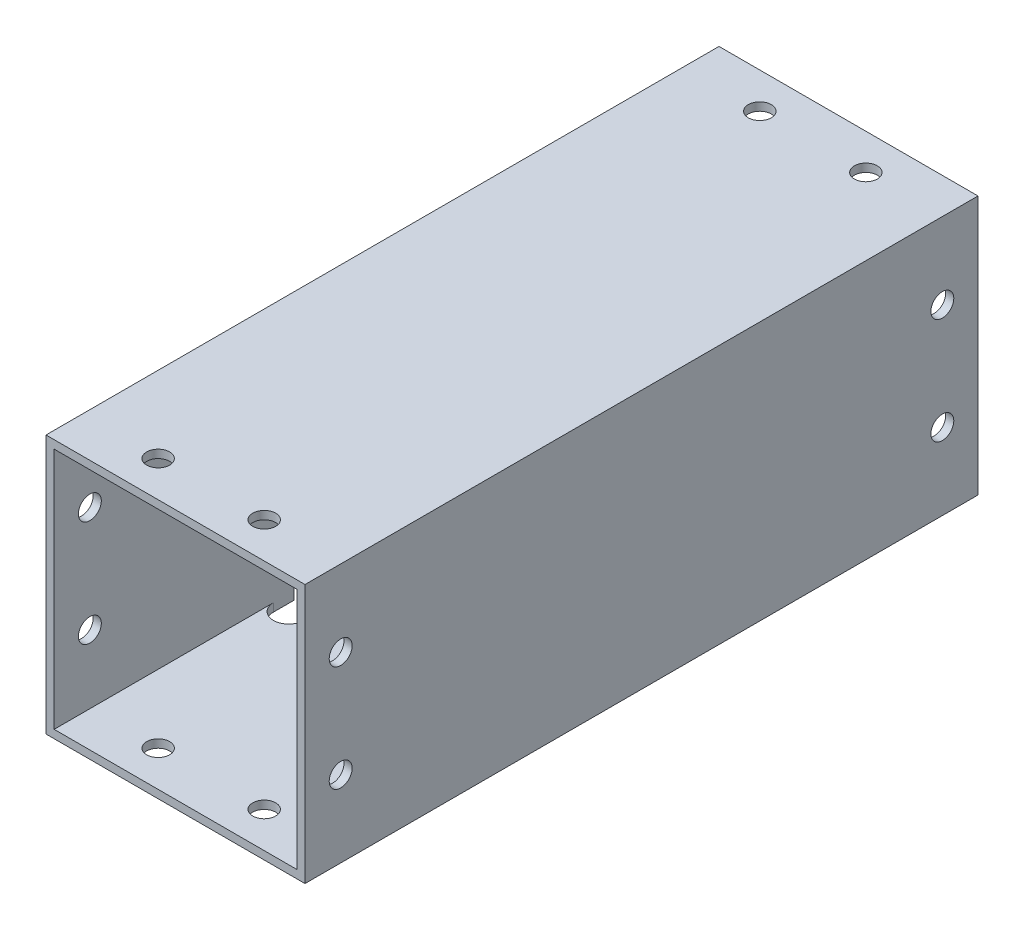
ISO-10303-21;
HEADER;
FILE_DESCRIPTION(('STEP AP214'),'2;1');
FILE_NAME('part.step','',(''),(''),'','','');
FILE_SCHEMA(('AUTOMOTIVE_DESIGN { 1 0 10303 214 1 1 1 1 }'));
ENDSEC;
DATA;
#1=APPLICATION_CONTEXT('core data for automotive mechanical design processes');
#2=APPLICATION_PROTOCOL_DEFINITION('international standard','automotive_design',2000,#1);
#3=PRODUCT_CONTEXT('',#1,'mechanical');
#4=PRODUCT('Part','Part','',(#3));
#5=PRODUCT_RELATED_PRODUCT_CATEGORY('part','',(#4));
#6=PRODUCT_DEFINITION_FORMATION('','',#4);
#7=PRODUCT_DEFINITION_CONTEXT('part definition',#1,'design');
#8=PRODUCT_DEFINITION('design','',#6,#7);
#9=PRODUCT_DEFINITION_SHAPE('','',#8);
#10=(LENGTH_UNIT() NAMED_UNIT(*) SI_UNIT(.MILLI.,.METRE.));
#11=(NAMED_UNIT(*) PLANE_ANGLE_UNIT() SI_UNIT($,.RADIAN.));
#12=(NAMED_UNIT(*) SI_UNIT($,.STERADIAN.) SOLID_ANGLE_UNIT());
#13=UNCERTAINTY_MEASURE_WITH_UNIT(LENGTH_MEASURE(1.E-05),#10,'distance_accuracy_value','');
#14=(GEOMETRIC_REPRESENTATION_CONTEXT(3) GLOBAL_UNCERTAINTY_ASSIGNED_CONTEXT((#13)) GLOBAL_UNIT_ASSIGNED_CONTEXT((#10,
#11,#12)) REPRESENTATION_CONTEXT('',''));
#15=CARTESIAN_POINT('',(0.,0.,0.));
#16=DIRECTION('',(0.,0.,1.));
#17=DIRECTION('',(1.,0.,0.));
#18=AXIS2_PLACEMENT_3D('',#15,#16,#17);
#19=CARTESIAN_POINT('',(0.,0.,132.));
#20=DIRECTION('',(0.,0.,-1.));
#21=DIRECTION('',(-1.,0.,0.));
#22=AXIS2_PLACEMENT_3D('',#19,#20,#21);
#23=PLANE('',#22);
#24=DIRECTION('',(0.,1.,0.));
#25=VECTOR('',#24,1.);
#26=CARTESIAN_POINT('',(25.4,-25.4,132.));
#27=LINE('',#26,#25);
#28=CARTESIAN_POINT('',(25.4,-25.4,132.));
#29=VERTEX_POINT('',#28);
#30=CARTESIAN_POINT('',(25.4,25.4,132.));
#31=VERTEX_POINT('',#30);
#32=EDGE_CURVE('E327',#29,#31,#27,.T.);
#33=ORIENTED_EDGE('',*,*,#32,.T.);
#34=DIRECTION('',(-1.,0.,0.));
#35=VECTOR('',#34,1.);
#36=CARTESIAN_POINT('',(-25.4,25.4,132.));
#37=LINE('',#36,#35);
#38=CARTESIAN_POINT('',(-25.4,25.4,132.));
#39=VERTEX_POINT('',#38);
#40=EDGE_CURVE('E330',#31,#39,#37,.T.);
#41=ORIENTED_EDGE('',*,*,#40,.T.);
#42=DIRECTION('',(0.,-1.,0.));
#43=VECTOR('',#42,1.);
#44=CARTESIAN_POINT('',(-25.4,-25.4,132.));
#45=LINE('',#44,#43);
#46=CARTESIAN_POINT('',(-25.4,-25.4,132.));
#47=VERTEX_POINT('',#46);
#48=EDGE_CURVE('E333',#39,#47,#45,.T.);
#49=ORIENTED_EDGE('',*,*,#48,.T.);
#50=DIRECTION('',(1.,0.,0.));
#51=VECTOR('',#50,1.);
#52=CARTESIAN_POINT('',(-25.4,-25.4,132.));
#53=LINE('',#52,#51);
#54=EDGE_CURVE('E335',#47,#29,#53,.T.);
#55=ORIENTED_EDGE('',*,*,#54,.T.);
#56=EDGE_LOOP('',(#33,#41,#49,#55));
#57=FACE_BOUND('',#56,.T.);
#58=DIRECTION('',(0.,-1.,0.));
#59=VECTOR('',#58,1.);
#60=CARTESIAN_POINT('',(-23.8,-23.8,132.));
#61=LINE('',#60,#59);
#62=CARTESIAN_POINT('',(-23.8,23.8,132.));
#63=VERTEX_POINT('',#62);
#64=CARTESIAN_POINT('',(-23.8,-23.8,132.));
#65=VERTEX_POINT('',#64);
#66=EDGE_CURVE('E299',#63,#65,#61,.T.);
#67=ORIENTED_EDGE('',*,*,#66,.F.);
#68=DIRECTION('',(-1.,0.,0.));
#69=VECTOR('',#68,1.);
#70=CARTESIAN_POINT('',(-23.8,23.8,132.));
#71=LINE('',#70,#69);
#72=CARTESIAN_POINT('',(23.8,23.8,132.));
#73=VERTEX_POINT('',#72);
#74=EDGE_CURVE('E306',#73,#63,#71,.T.);
#75=ORIENTED_EDGE('',*,*,#74,.F.);
#76=DIRECTION('',(0.,1.,0.));
#77=VECTOR('',#76,1.);
#78=CARTESIAN_POINT('',(23.8,-23.8,132.));
#79=LINE('',#78,#77);
#80=CARTESIAN_POINT('',(23.8,-23.8,132.));
#81=VERTEX_POINT('',#80);
#82=EDGE_CURVE('E304',#81,#73,#79,.T.);
#83=ORIENTED_EDGE('',*,*,#82,.F.);
#84=DIRECTION('',(1.,0.,0.));
#85=VECTOR('',#84,1.);
#86=CARTESIAN_POINT('',(-23.8,-23.8,132.));
#87=LINE('',#86,#85);
#88=EDGE_CURVE('E301',#65,#81,#87,.T.);
#89=ORIENTED_EDGE('',*,*,#88,.F.);
#90=EDGE_LOOP('',(#67,#75,#83,#89));
#91=FACE_BOUND('',#90,.T.);
#92=ADVANCED_FACE('F38',(#57,#91),#23,.F.);
#93=CARTESIAN_POINT('',(0.,0.,0.));
#94=DIRECTION('',(0.,0.,-1.));
#95=DIRECTION('',(-1.,0.,0.));
#96=AXIS2_PLACEMENT_3D('',#93,#94,#95);
#97=PLANE('',#96);
#98=DIRECTION('',(0.,1.,0.));
#99=VECTOR('',#98,1.);
#100=CARTESIAN_POINT('',(25.4,-25.4,0.));
#101=LINE('',#100,#99);
#102=CARTESIAN_POINT('',(25.4,-25.4,0.));
#103=VERTEX_POINT('',#102);
#104=CARTESIAN_POINT('',(25.4,25.4,0.));
#105=VERTEX_POINT('',#104);
#106=EDGE_CURVE('E326',#103,#105,#101,.T.);
#107=ORIENTED_EDGE('',*,*,#106,.F.);
#108=DIRECTION('',(1.,0.,0.));
#109=VECTOR('',#108,1.);
#110=CARTESIAN_POINT('',(-25.4,-25.4,0.));
#111=LINE('',#110,#109);
#112=CARTESIAN_POINT('',(-25.4,-25.4,0.));
#113=VERTEX_POINT('',#112);
#114=EDGE_CURVE('E331',#113,#103,#111,.T.);
#115=ORIENTED_EDGE('',*,*,#114,.F.);
#116=DIRECTION('',(0.,-1.,0.));
#117=VECTOR('',#116,1.);
#118=CARTESIAN_POINT('',(-25.4,-25.4,0.));
#119=LINE('',#118,#117);
#120=CARTESIAN_POINT('',(-25.4,25.4,0.));
#121=VERTEX_POINT('',#120);
#122=EDGE_CURVE('E342',#121,#113,#119,.T.);
#123=ORIENTED_EDGE('',*,*,#122,.F.);
#124=DIRECTION('',(-1.,0.,0.));
#125=VECTOR('',#124,1.);
#126=CARTESIAN_POINT('',(-25.4,25.4,0.));
#127=LINE('',#126,#125);
#128=EDGE_CURVE('E340',#105,#121,#127,.T.);
#129=ORIENTED_EDGE('',*,*,#128,.F.);
#130=EDGE_LOOP('',(#107,#115,#123,#129));
#131=FACE_BOUND('',#130,.T.);
#132=DIRECTION('',(-1.,0.,0.));
#133=VECTOR('',#132,1.);
#134=CARTESIAN_POINT('',(-23.8,23.8,0.));
#135=LINE('',#134,#133);
#136=CARTESIAN_POINT('',(23.8,23.8,0.));
#137=VERTEX_POINT('',#136);
#138=CARTESIAN_POINT('',(-23.8,23.8,0.));
#139=VERTEX_POINT('',#138);
#140=EDGE_CURVE('E302',#137,#139,#135,.T.);
#141=ORIENTED_EDGE('',*,*,#140,.T.);
#142=DIRECTION('',(0.,-1.,0.));
#143=VECTOR('',#142,1.);
#144=CARTESIAN_POINT('',(-23.8,-23.8,0.));
#145=LINE('',#144,#143);
#146=CARTESIAN_POINT('',(-23.8,-23.8,0.));
#147=VERTEX_POINT('',#146);
#148=EDGE_CURVE('E61',#139,#147,#145,.T.);
#149=ORIENTED_EDGE('',*,*,#148,.T.);
#150=DIRECTION('',(1.,0.,0.));
#151=VECTOR('',#150,1.);
#152=CARTESIAN_POINT('',(-23.8,-23.8,0.));
#153=LINE('',#152,#151);
#154=CARTESIAN_POINT('',(23.8,-23.8,0.));
#155=VERTEX_POINT('',#154);
#156=EDGE_CURVE('E310',#147,#155,#153,.T.);
#157=ORIENTED_EDGE('',*,*,#156,.T.);
#158=DIRECTION('',(0.,1.,0.));
#159=VECTOR('',#158,1.);
#160=CARTESIAN_POINT('',(23.8,-23.8,0.));
#161=LINE('',#160,#159);
#162=EDGE_CURVE('E313',#155,#137,#161,.T.);
#163=ORIENTED_EDGE('',*,*,#162,.T.);
#164=EDGE_LOOP('',(#141,#149,#157,#163));
#165=FACE_BOUND('',#164,.T.);
#166=ADVANCED_FACE('F398',(#131,#165),#97,.T.);
#167=CARTESIAN_POINT('',(25.4,-25.4,132.));
#168=DIRECTION('',(-1.,0.,0.));
#169=DIRECTION('',(0.,0.,1.));
#170=AXIS2_PLACEMENT_3D('',#167,#168,#169);
#171=PLANE('',#170);
#172=CARTESIAN_POINT('',(25.4,-10.4,125.));
#173=DIRECTION('',(1.,0.,0.));
#174=DIRECTION('',(0.,0.,-1.));
#175=AXIS2_PLACEMENT_3D('',#172,#173,#174);
#176=CIRCLE('',#175,2.24999999999999);
#177=CARTESIAN_POINT('',(25.4,-10.4,122.75));
#178=VERTEX_POINT('',#177);
#179=EDGE_CURVE('E223',#178,#178,#176,.T.);
#180=ORIENTED_EDGE('',*,*,#179,.F.);
#181=EDGE_LOOP('',(#180));
#182=FACE_BOUND('',#181,.T.);
#183=CARTESIAN_POINT('',(25.4,10.4,125.));
#184=DIRECTION('',(1.,0.,0.));
#185=DIRECTION('',(0.,0.,-1.));
#186=AXIS2_PLACEMENT_3D('',#183,#184,#185);
#187=CIRCLE('',#186,2.24999999999999);
#188=CARTESIAN_POINT('',(25.4,10.4,122.75));
#189=VERTEX_POINT('',#188);
#190=EDGE_CURVE('E227',#189,#189,#187,.T.);
#191=ORIENTED_EDGE('',*,*,#190,.F.);
#192=EDGE_LOOP('',(#191));
#193=FACE_BOUND('',#192,.T.);
#194=CARTESIAN_POINT('',(25.4,-10.4,7.));
#195=DIRECTION('',(1.,0.,0.));
#196=DIRECTION('',(0.,0.,-1.));
#197=AXIS2_PLACEMENT_3D('',#194,#195,#196);
#198=CIRCLE('',#197,2.24999999999999);
#199=CARTESIAN_POINT('',(25.4,-10.4,4.75000000000001));
#200=VERTEX_POINT('',#199);
#201=EDGE_CURVE('E267',#200,#200,#198,.T.);
#202=ORIENTED_EDGE('',*,*,#201,.F.);
#203=EDGE_LOOP('',(#202));
#204=FACE_BOUND('',#203,.T.);
#205=CARTESIAN_POINT('',(25.4,10.4,7.));
#206=DIRECTION('',(1.,0.,0.));
#207=DIRECTION('',(0.,0.,-1.));
#208=AXIS2_PLACEMENT_3D('',#205,#206,#207);
#209=CIRCLE('',#208,2.24999999999999);
#210=CARTESIAN_POINT('',(25.4,10.4,4.75000000000001));
#211=VERTEX_POINT('',#210);
#212=EDGE_CURVE('E273',#211,#211,#209,.T.);
#213=ORIENTED_EDGE('',*,*,#212,.F.);
#214=EDGE_LOOP('',(#213));
#215=FACE_BOUND('',#214,.T.);
#216=ORIENTED_EDGE('',*,*,#106,.T.);
#217=DIRECTION('',(0.,0.,-1.));
#218=VECTOR('',#217,1.);
#219=CARTESIAN_POINT('',(25.4,25.4,132.));
#220=LINE('',#219,#218);
#221=EDGE_CURVE('E355',#31,#105,#220,.T.);
#222=ORIENTED_EDGE('',*,*,#221,.F.);
#223=ORIENTED_EDGE('',*,*,#32,.F.);
#224=DIRECTION('',(0.,0.,-1.));
#225=VECTOR('',#224,1.);
#226=CARTESIAN_POINT('',(25.4,-25.4,132.));
#227=LINE('',#226,#225);
#228=EDGE_CURVE('E337',#29,#103,#227,.T.);
#229=ORIENTED_EDGE('',*,*,#228,.T.);
#230=EDGE_LOOP('',(#216,#222,#223,#229));
#231=FACE_BOUND('',#230,.T.);
#232=ADVANCED_FACE('F40',(#182,#193,#204,#215,#231),#171,.F.);
#233=CARTESIAN_POINT('',(-25.4,25.4,132.));
#234=DIRECTION('',(0.,-1.,0.));
#235=DIRECTION('',(0.,0.,-1.));
#236=AXIS2_PLACEMENT_3D('',#233,#234,#235);
#237=PLANE('',#236);
#238=CARTESIAN_POINT('',(10.3999999999997,25.4000000000001,125.));
#239=DIRECTION('',(0.,1.,0.));
#240=DIRECTION('',(0.,0.,1.));
#241=AXIS2_PLACEMENT_3D('',#238,#239,#240);
#242=CIRCLE('',#241,2.24999999999999);
#243=CARTESIAN_POINT('',(10.3999999999997,25.4000000000001,127.25));
#244=VERTEX_POINT('',#243);
#245=EDGE_CURVE('E211',#244,#244,#242,.T.);
#246=ORIENTED_EDGE('',*,*,#245,.F.);
#247=EDGE_LOOP('',(#246));
#248=FACE_BOUND('',#247,.T.);
#249=CARTESIAN_POINT('',(-10.4000000000003,25.3999999999999,125.));
#250=DIRECTION('',(0.,1.,0.));
#251=DIRECTION('',(0.,0.,1.));
#252=AXIS2_PLACEMENT_3D('',#249,#250,#251);
#253=CIRCLE('',#252,2.24999999999999);
#254=CARTESIAN_POINT('',(-10.4000000000003,25.3999999999999,127.25));
#255=VERTEX_POINT('',#254);
#256=EDGE_CURVE('E217',#255,#255,#253,.T.);
#257=ORIENTED_EDGE('',*,*,#256,.F.);
#258=EDGE_LOOP('',(#257));
#259=FACE_BOUND('',#258,.T.);
#260=CARTESIAN_POINT('',(10.3999999999997,25.4000000000001,7.));
#261=DIRECTION('',(0.,1.,0.));
#262=DIRECTION('',(0.,0.,1.));
#263=AXIS2_PLACEMENT_3D('',#260,#261,#262);
#264=CIRCLE('',#263,2.24999999999999);
#265=CARTESIAN_POINT('',(10.3999999999997,25.4000000000001,9.24999999999999));
#266=VERTEX_POINT('',#265);
#267=EDGE_CURVE('E257',#266,#266,#264,.T.);
#268=ORIENTED_EDGE('',*,*,#267,.F.);
#269=EDGE_LOOP('',(#268));
#270=FACE_BOUND('',#269,.T.);
#271=CARTESIAN_POINT('',(-10.4000000000003,25.3999999999999,7.));
#272=DIRECTION('',(0.,1.,0.));
#273=DIRECTION('',(0.,0.,1.));
#274=AXIS2_PLACEMENT_3D('',#271,#272,#273);
#275=CIRCLE('',#274,2.24999999999999);
#276=CARTESIAN_POINT('',(-10.4000000000003,25.3999999999999,9.24999999999999));
#277=VERTEX_POINT('',#276);
#278=EDGE_CURVE('E261',#277,#277,#275,.T.);
#279=ORIENTED_EDGE('',*,*,#278,.F.);
#280=EDGE_LOOP('',(#279));
#281=FACE_BOUND('',#280,.T.);
#282=ORIENTED_EDGE('',*,*,#128,.T.);
#283=DIRECTION('',(0.,0.,-1.));
#284=VECTOR('',#283,1.);
#285=CARTESIAN_POINT('',(-25.4,25.4,132.));
#286=LINE('',#285,#284);
#287=EDGE_CURVE('E352',#39,#121,#286,.T.);
#288=ORIENTED_EDGE('',*,*,#287,.F.);
#289=ORIENTED_EDGE('',*,*,#40,.F.);
#290=ORIENTED_EDGE('',*,*,#221,.T.);
#291=EDGE_LOOP('',(#282,#288,#289,#290));
#292=FACE_BOUND('',#291,.T.);
#293=ADVANCED_FACE('F402',(#248,#259,#270,#281,#292),#237,.F.);
#294=CARTESIAN_POINT('',(-25.4,-25.4,132.));
#295=DIRECTION('',(1.,0.,0.));
#296=DIRECTION('',(0.,0.,-1.));
#297=AXIS2_PLACEMENT_3D('',#294,#295,#296);
#298=PLANE('',#297);
#299=CARTESIAN_POINT('',(-25.4,10.4,125.));
#300=DIRECTION('',(-1.,0.,0.));
#301=DIRECTION('',(0.,0.,1.));
#302=AXIS2_PLACEMENT_3D('',#299,#300,#301);
#303=CIRCLE('',#302,2.24999999999999);
#304=CARTESIAN_POINT('',(-25.4,10.4,127.25));
#305=VERTEX_POINT('',#304);
#306=EDGE_CURVE('E245',#305,#305,#303,.T.);
#307=ORIENTED_EDGE('',*,*,#306,.F.);
#308=EDGE_LOOP('',(#307));
#309=FACE_BOUND('',#308,.T.);
#310=CARTESIAN_POINT('',(-25.4,-10.4,125.));
#311=DIRECTION('',(-1.,0.,0.));
#312=DIRECTION('',(0.,0.,1.));
#313=AXIS2_PLACEMENT_3D('',#310,#311,#312);
#314=CIRCLE('',#313,2.24999999999999);
#315=CARTESIAN_POINT('',(-25.4,-10.4,127.25));
#316=VERTEX_POINT('',#315);
#317=EDGE_CURVE('E251',#316,#316,#314,.T.);
#318=ORIENTED_EDGE('',*,*,#317,.F.);
#319=EDGE_LOOP('',(#318));
#320=FACE_BOUND('',#319,.T.);
#321=CARTESIAN_POINT('',(-25.4,10.4,7.));
#322=DIRECTION('',(-1.,0.,0.));
#323=DIRECTION('',(0.,0.,1.));
#324=AXIS2_PLACEMENT_3D('',#321,#322,#323);
#325=CIRCLE('',#324,2.24999999999999);
#326=CARTESIAN_POINT('',(-25.4,10.4,9.24999999999999));
#327=VERTEX_POINT('',#326);
#328=EDGE_CURVE('E287',#327,#327,#325,.T.);
#329=ORIENTED_EDGE('',*,*,#328,.F.);
#330=EDGE_LOOP('',(#329));
#331=FACE_BOUND('',#330,.T.);
#332=CARTESIAN_POINT('',(-25.4,-10.4,7.));
#333=DIRECTION('',(-1.,0.,0.));
#334=DIRECTION('',(0.,0.,1.));
#335=AXIS2_PLACEMENT_3D('',#332,#333,#334);
#336=CIRCLE('',#335,2.24999999999999);
#337=CARTESIAN_POINT('',(-25.4,-10.4,9.24999999999999));
#338=VERTEX_POINT('',#337);
#339=EDGE_CURVE('E293',#338,#338,#336,.T.);
#340=ORIENTED_EDGE('',*,*,#339,.F.);
#341=EDGE_LOOP('',(#340));
#342=FACE_BOUND('',#341,.T.);
#343=CARTESIAN_POINT('',(-25.4,-15.1,82.));
#344=DIRECTION('',(-1.,0.,0.));
#345=DIRECTION('',(0.,0.,1.));
#346=AXIS2_PLACEMENT_3D('',#343,#344,#345);
#347=CIRCLE('',#346,3.);
#348=CARTESIAN_POINT('',(-25.4,-15.1,85.));
#349=VERTEX_POINT('',#348);
#350=CARTESIAN_POINT('',(-25.4,-15.1,79.));
#351=VERTEX_POINT('',#350);
#352=EDGE_CURVE('E186',#349,#351,#347,.T.);
#353=ORIENTED_EDGE('',*,*,#352,.F.);
#354=DIRECTION('',(0.,1.,0.));
#355=VECTOR('',#354,1.);
#356=CARTESIAN_POINT('',(-25.4,-15.1,85.));
#357=LINE('',#356,#355);
#358=CARTESIAN_POINT('',(-25.4,-25.4,85.));
#359=VERTEX_POINT('',#358);
#360=EDGE_CURVE('E195',#359,#349,#357,.T.);
#361=ORIENTED_EDGE('',*,*,#360,.F.);
#362=DIRECTION('',(0.,0.,-1.));
#363=VECTOR('',#362,1.);
#364=CARTESIAN_POINT('',(-25.4,-25.4,132.));
#365=LINE('',#364,#363);
#366=EDGE_CURVE('E349',#47,#359,#365,.T.);
#367=ORIENTED_EDGE('',*,*,#366,.F.);
#368=ORIENTED_EDGE('',*,*,#48,.F.);
#369=ORIENTED_EDGE('',*,*,#287,.T.);
#370=ORIENTED_EDGE('',*,*,#122,.T.);
#371=CARTESIAN_POINT('',(-25.4,-25.4,79.));
#372=VERTEX_POINT('',#371);
#373=EDGE_CURVE('E348',#372,#113,#365,.T.);
#374=ORIENTED_EDGE('',*,*,#373,.F.);
#375=DIRECTION('',(0.,-1.,0.));
#376=VECTOR('',#375,1.);
#377=CARTESIAN_POINT('',(-25.4,-15.1,79.));
#378=LINE('',#377,#376);
#379=EDGE_CURVE('E192',#351,#372,#378,.T.);
#380=ORIENTED_EDGE('',*,*,#379,.F.);
#381=EDGE_LOOP('',(#353,#361,#367,#368,#369,#370,#374,#380));
#382=FACE_BOUND('',#381,.T.);
#383=ADVANCED_FACE('F388',(#309,#320,#331,#342,#382),#298,.F.);
#384=CARTESIAN_POINT('',(-25.4,-25.4,132.));
#385=DIRECTION('',(0.,1.,0.));
#386=DIRECTION('',(0.,0.,1.));
#387=AXIS2_PLACEMENT_3D('',#384,#385,#386);
#388=PLANE('',#387);
#389=CARTESIAN_POINT('',(-20.8,-25.4,75.));
#390=DIRECTION('',(0.,-1.,0.));
#391=DIRECTION('',(0.,0.,-1.));
#392=AXIS2_PLACEMENT_3D('',#389,#390,#391);
#393=CIRCLE('',#392,3.);
#394=CARTESIAN_POINT('',(-23.8,-25.4,75.));
#395=VERTEX_POINT('',#394);
#396=CARTESIAN_POINT('',(-17.8,-25.4,75.));
#397=VERTEX_POINT('',#396);
#398=EDGE_CURVE('E166',#395,#397,#393,.T.);
#399=ORIENTED_EDGE('',*,*,#398,.F.);
#400=DIRECTION('',(0.,0.,-1.));
#401=VECTOR('',#400,1.);
#402=CARTESIAN_POINT('',(-23.8,-25.4,75.));
#403=LINE('',#402,#401);
#404=CARTESIAN_POINT('',(-23.8,-25.4,79.));
#405=VERTEX_POINT('',#404);
#406=EDGE_CURVE('E180',#405,#395,#403,.T.);
#407=ORIENTED_EDGE('',*,*,#406,.F.);
#408=DIRECTION('',(-1.,0.,0.));
#409=VECTOR('',#408,1.);
#410=CARTESIAN_POINT('',(-25.4,-25.4,79.));
#411=LINE('',#410,#409);
#412=EDGE_CURVE('E204',#405,#372,#411,.T.);
#413=ORIENTED_EDGE('',*,*,#412,.T.);
#414=ORIENTED_EDGE('',*,*,#373,.T.);
#415=ORIENTED_EDGE('',*,*,#114,.T.);
#416=ORIENTED_EDGE('',*,*,#228,.F.);
#417=ORIENTED_EDGE('',*,*,#54,.F.);
#418=ORIENTED_EDGE('',*,*,#366,.T.);
#419=DIRECTION('',(1.,0.,0.));
#420=VECTOR('',#419,1.);
#421=CARTESIAN_POINT('',(-25.4,-25.4,85.));
#422=LINE('',#421,#420);
#423=CARTESIAN_POINT('',(-23.8,-25.4,85.));
#424=VERTEX_POINT('',#423);
#425=EDGE_CURVE('E208',#359,#424,#422,.T.);
#426=ORIENTED_EDGE('',*,*,#425,.T.);
#427=CARTESIAN_POINT('',(-23.8,-25.4,89.));
#428=VERTEX_POINT('',#427);
#429=EDGE_CURVE('E163',#428,#424,#403,.T.);
#430=ORIENTED_EDGE('',*,*,#429,.F.);
#431=CARTESIAN_POINT('',(-20.8,-25.4,89.));
#432=DIRECTION('',(0.,-1.,0.));
#433=DIRECTION('',(0.,0.,-1.));
#434=AXIS2_PLACEMENT_3D('',#431,#432,#433);
#435=CIRCLE('',#434,3.);
#436=CARTESIAN_POINT('',(-17.8,-25.4,89.));
#437=VERTEX_POINT('',#436);
#438=EDGE_CURVE('E178',#437,#428,#435,.T.);
#439=ORIENTED_EDGE('',*,*,#438,.F.);
#440=DIRECTION('',(0.,0.,1.));
#441=VECTOR('',#440,1.);
#442=CARTESIAN_POINT('',(-17.8,-25.4,75.));
#443=LINE('',#442,#441);
#444=EDGE_CURVE('E156',#397,#437,#443,.T.);
#445=ORIENTED_EDGE('',*,*,#444,.F.);
#446=EDGE_LOOP('',(#399,#407,#413,#414,#415,#416,#417,#418,#426,#430,#439,#445));
#447=FACE_BOUND('',#446,.T.);
#448=CARTESIAN_POINT('',(-10.3999999999999,-25.4,125.));
#449=DIRECTION('',(0.,-1.,0.));
#450=DIRECTION('',(0.,0.,-1.));
#451=AXIS2_PLACEMENT_3D('',#448,#449,#450);
#452=CIRCLE('',#451,2.24999999999999);
#453=CARTESIAN_POINT('',(-10.3999999999999,-25.4,122.75));
#454=VERTEX_POINT('',#453);
#455=EDGE_CURVE('E233',#454,#454,#452,.T.);
#456=ORIENTED_EDGE('',*,*,#455,.F.);
#457=EDGE_LOOP('',(#456));
#458=FACE_BOUND('',#457,.T.);
#459=CARTESIAN_POINT('',(10.4000000000001,-25.4,125.));
#460=DIRECTION('',(0.,-1.,0.));
#461=DIRECTION('',(0.,0.,-1.));
#462=AXIS2_PLACEMENT_3D('',#459,#460,#461);
#463=CIRCLE('',#462,2.24999999999999);
#464=CARTESIAN_POINT('',(10.4000000000001,-25.4,122.75));
#465=VERTEX_POINT('',#464);
#466=EDGE_CURVE('E239',#465,#465,#463,.T.);
#467=ORIENTED_EDGE('',*,*,#466,.F.);
#468=EDGE_LOOP('',(#467));
#469=FACE_BOUND('',#468,.T.);
#470=CARTESIAN_POINT('',(-10.3999999999999,-25.4,7.));
#471=DIRECTION('',(0.,-1.,0.));
#472=DIRECTION('',(0.,0.,-1.));
#473=AXIS2_PLACEMENT_3D('',#470,#471,#472);
#474=CIRCLE('',#473,2.24999999999999);
#475=CARTESIAN_POINT('',(-10.3999999999999,-25.4,4.75000000000001));
#476=VERTEX_POINT('',#475);
#477=EDGE_CURVE('E277',#476,#476,#474,.T.);
#478=ORIENTED_EDGE('',*,*,#477,.F.);
#479=EDGE_LOOP('',(#478));
#480=FACE_BOUND('',#479,.T.);
#481=CARTESIAN_POINT('',(10.4000000000001,-25.4,7.));
#482=DIRECTION('',(0.,-1.,0.));
#483=DIRECTION('',(0.,0.,-1.));
#484=AXIS2_PLACEMENT_3D('',#481,#482,#483);
#485=CIRCLE('',#484,2.24999999999999);
#486=CARTESIAN_POINT('',(10.4000000000001,-25.4,4.75000000000001));
#487=VERTEX_POINT('',#486);
#488=EDGE_CURVE('E281',#487,#487,#485,.T.);
#489=ORIENTED_EDGE('',*,*,#488,.F.);
#490=EDGE_LOOP('',(#489));
#491=FACE_BOUND('',#490,.T.);
#492=ADVANCED_FACE('F174',(#447,#458,#469,#480,#491),#388,.F.);
#493=CARTESIAN_POINT('',(-23.8,-23.8,132.));
#494=DIRECTION('',(1.,0.,0.));
#495=DIRECTION('',(0.,0.,-1.));
#496=AXIS2_PLACEMENT_3D('',#493,#494,#495);
#497=PLANE('',#496);
#498=DIRECTION('',(0.,-1.,0.));
#499=VECTOR('',#498,1.);
#500=CARTESIAN_POINT('',(-23.8,-15.4,75.));
#501=LINE('',#500,#499);
#502=CARTESIAN_POINT('',(-23.8,-23.8,75.));
#503=VERTEX_POINT('',#502);
#504=EDGE_CURVE('E169',#503,#395,#501,.T.);
#505=ORIENTED_EDGE('',*,*,#504,.F.);
#506=DIRECTION('',(0.,0.,-1.));
#507=VECTOR('',#506,1.);
#508=CARTESIAN_POINT('',(-23.8,-23.8,132.));
#509=LINE('',#508,#507);
#510=EDGE_CURVE('E322',#503,#147,#509,.T.);
#511=ORIENTED_EDGE('',*,*,#510,.T.);
#512=ORIENTED_EDGE('',*,*,#148,.F.);
#513=DIRECTION('',(0.,0.,-1.));
#514=VECTOR('',#513,1.);
#515=CARTESIAN_POINT('',(-23.8,23.8,132.));
#516=LINE('',#515,#514);
#517=EDGE_CURVE('E308',#63,#139,#516,.T.);
#518=ORIENTED_EDGE('',*,*,#517,.F.);
#519=ORIENTED_EDGE('',*,*,#66,.T.);
#520=CARTESIAN_POINT('',(-23.8,-23.8,89.));
#521=VERTEX_POINT('',#520);
#522=EDGE_CURVE('E323',#65,#521,#509,.T.);
#523=ORIENTED_EDGE('',*,*,#522,.T.);
#524=DIRECTION('',(0.,-1.,0.));
#525=VECTOR('',#524,1.);
#526=CARTESIAN_POINT('',(-23.8,-15.4,89.));
#527=LINE('',#526,#525);
#528=EDGE_CURVE('E187',#521,#428,#527,.T.);
#529=ORIENTED_EDGE('',*,*,#528,.T.);
#530=ORIENTED_EDGE('',*,*,#429,.T.);
#531=DIRECTION('',(0.,-1.,0.));
#532=VECTOR('',#531,1.);
#533=CARTESIAN_POINT('',(-23.8,-23.8,85.));
#534=LINE('',#533,#532);
#535=CARTESIAN_POINT('',(-23.8,-15.1,85.));
#536=VERTEX_POINT('',#535);
#537=EDGE_CURVE('E206',#536,#424,#534,.T.);
#538=ORIENTED_EDGE('',*,*,#537,.F.);
#539=CARTESIAN_POINT('',(-23.8,-15.1,82.));
#540=DIRECTION('',(1.,0.,0.));
#541=DIRECTION('',(0.,0.,-1.));
#542=AXIS2_PLACEMENT_3D('',#539,#540,#541);
#543=CIRCLE('',#542,3.);
#544=CARTESIAN_POINT('',(-23.8,-15.1,79.));
#545=VERTEX_POINT('',#544);
#546=EDGE_CURVE('E358',#545,#536,#543,.T.);
#547=ORIENTED_EDGE('',*,*,#546,.F.);
#548=DIRECTION('',(0.,1.,0.));
#549=VECTOR('',#548,1.);
#550=CARTESIAN_POINT('',(-23.8,-23.8,79.));
#551=LINE('',#550,#549);
#552=EDGE_CURVE('E201',#405,#545,#551,.T.);
#553=ORIENTED_EDGE('',*,*,#552,.F.);
#554=ORIENTED_EDGE('',*,*,#406,.T.);
#555=EDGE_LOOP('',(#505,#511,#512,#518,#519,#523,#529,#530,#538,#547,#553,#554));
#556=FACE_BOUND('',#555,.T.);
#557=CARTESIAN_POINT('',(-23.8,10.4,125.));
#558=DIRECTION('',(1.,0.,0.));
#559=DIRECTION('',(0.,0.,-1.));
#560=AXIS2_PLACEMENT_3D('',#557,#558,#559);
#561=CIRCLE('',#560,2.24999999999999);
#562=CARTESIAN_POINT('',(-23.8,10.4,122.75));
#563=VERTEX_POINT('',#562);
#564=EDGE_CURVE('E248',#563,#563,#561,.T.);
#565=ORIENTED_EDGE('',*,*,#564,.F.);
#566=EDGE_LOOP('',(#565));
#567=FACE_BOUND('',#566,.T.);
#568=CARTESIAN_POINT('',(-23.8,-10.4,125.));
#569=DIRECTION('',(1.,0.,0.));
#570=DIRECTION('',(0.,0.,-1.));
#571=AXIS2_PLACEMENT_3D('',#568,#569,#570);
#572=CIRCLE('',#571,2.24999999999999);
#573=CARTESIAN_POINT('',(-23.8,-10.4,122.75));
#574=VERTEX_POINT('',#573);
#575=EDGE_CURVE('E254',#574,#574,#572,.T.);
#576=ORIENTED_EDGE('',*,*,#575,.F.);
#577=EDGE_LOOP('',(#576));
#578=FACE_BOUND('',#577,.T.);
#579=CARTESIAN_POINT('',(-23.8,10.4,7.));
#580=DIRECTION('',(1.,0.,0.));
#581=DIRECTION('',(0.,0.,-1.));
#582=AXIS2_PLACEMENT_3D('',#579,#580,#581);
#583=CIRCLE('',#582,2.24999999999999);
#584=CARTESIAN_POINT('',(-23.8,10.4,4.75000000000001));
#585=VERTEX_POINT('',#584);
#586=EDGE_CURVE('E290',#585,#585,#583,.T.);
#587=ORIENTED_EDGE('',*,*,#586,.F.);
#588=EDGE_LOOP('',(#587));
#589=FACE_BOUND('',#588,.T.);
#590=CARTESIAN_POINT('',(-23.8,-10.4,7.));
#591=DIRECTION('',(1.,0.,0.));
#592=DIRECTION('',(0.,0.,-1.));
#593=AXIS2_PLACEMENT_3D('',#590,#591,#592);
#594=CIRCLE('',#593,2.24999999999999);
#595=CARTESIAN_POINT('',(-23.8,-10.4,4.75000000000001));
#596=VERTEX_POINT('',#595);
#597=EDGE_CURVE('E296',#596,#596,#594,.T.);
#598=ORIENTED_EDGE('',*,*,#597,.F.);
#599=EDGE_LOOP('',(#598));
#600=FACE_BOUND('',#599,.T.);
#601=ADVANCED_FACE('F377',(#556,#567,#578,#589,#600),#497,.T.);
#602=CARTESIAN_POINT('',(-23.8,-23.8,132.));
#603=DIRECTION('',(0.,1.,0.));
#604=DIRECTION('',(0.,0.,1.));
#605=AXIS2_PLACEMENT_3D('',#602,#603,#604);
#606=PLANE('',#605);
#607=CARTESIAN_POINT('',(-20.8,-23.8,75.));
#608=DIRECTION('',(0.,1.,0.));
#609=DIRECTION('',(0.,0.,1.));
#610=AXIS2_PLACEMENT_3D('',#607,#608,#609);
#611=CIRCLE('',#610,3.);
#612=CARTESIAN_POINT('',(-17.8,-23.8,75.));
#613=VERTEX_POINT('',#612);
#614=EDGE_CURVE('E11',#613,#503,#611,.T.);
#615=ORIENTED_EDGE('',*,*,#614,.F.);
#616=DIRECTION('',(0.,0.,-1.));
#617=VECTOR('',#616,1.);
#618=CARTESIAN_POINT('',(-17.8,-23.8,132.));
#619=LINE('',#618,#617);
#620=CARTESIAN_POINT('',(-17.8,-23.8,89.));
#621=VERTEX_POINT('',#620);
#622=EDGE_CURVE('E159',#621,#613,#619,.T.);
#623=ORIENTED_EDGE('',*,*,#622,.F.);
#624=CARTESIAN_POINT('',(-20.8,-23.8,89.));
#625=DIRECTION('',(0.,1.,0.));
#626=DIRECTION('',(0.,0.,1.));
#627=AXIS2_PLACEMENT_3D('',#624,#625,#626);
#628=CIRCLE('',#627,3.);
#629=EDGE_CURVE('E46',#521,#621,#628,.T.);
#630=ORIENTED_EDGE('',*,*,#629,.F.);
#631=ORIENTED_EDGE('',*,*,#522,.F.);
#632=ORIENTED_EDGE('',*,*,#88,.T.);
#633=DIRECTION('',(0.,0.,-1.));
#634=VECTOR('',#633,1.);
#635=CARTESIAN_POINT('',(23.8,-23.8,132.));
#636=LINE('',#635,#634);
#637=EDGE_CURVE('E320',#81,#155,#636,.T.);
#638=ORIENTED_EDGE('',*,*,#637,.T.);
#639=ORIENTED_EDGE('',*,*,#156,.F.);
#640=ORIENTED_EDGE('',*,*,#510,.F.);
#641=EDGE_LOOP('',(#615,#623,#630,#631,#632,#638,#639,#640));
#642=FACE_BOUND('',#641,.T.);
#643=CARTESIAN_POINT('',(-10.3999999999999,-23.8,125.));
#644=DIRECTION('',(0.,1.,0.));
#645=DIRECTION('',(0.,0.,1.));
#646=AXIS2_PLACEMENT_3D('',#643,#644,#645);
#647=CIRCLE('',#646,2.24999999999999);
#648=CARTESIAN_POINT('',(-10.3999999999999,-23.8,127.25));
#649=VERTEX_POINT('',#648);
#650=EDGE_CURVE('E236',#649,#649,#647,.T.);
#651=ORIENTED_EDGE('',*,*,#650,.F.);
#652=EDGE_LOOP('',(#651));
#653=FACE_BOUND('',#652,.T.);
#654=CARTESIAN_POINT('',(10.4000000000001,-23.8,125.));
#655=DIRECTION('',(0.,1.,0.));
#656=DIRECTION('',(0.,0.,1.));
#657=AXIS2_PLACEMENT_3D('',#654,#655,#656);
#658=CIRCLE('',#657,2.24999999999999);
#659=CARTESIAN_POINT('',(10.4000000000001,-23.8,127.25));
#660=VERTEX_POINT('',#659);
#661=EDGE_CURVE('E242',#660,#660,#658,.T.);
#662=ORIENTED_EDGE('',*,*,#661,.F.);
#663=EDGE_LOOP('',(#662));
#664=FACE_BOUND('',#663,.T.);
#665=CARTESIAN_POINT('',(-10.3999999999999,-23.8,7.));
#666=DIRECTION('',(0.,1.,0.));
#667=DIRECTION('',(0.,0.,1.));
#668=AXIS2_PLACEMENT_3D('',#665,#666,#667);
#669=CIRCLE('',#668,2.24999999999999);
#670=CARTESIAN_POINT('',(-10.3999999999999,-23.8,9.24999999999999));
#671=VERTEX_POINT('',#670);
#672=EDGE_CURVE('E280',#671,#671,#669,.T.);
#673=ORIENTED_EDGE('',*,*,#672,.F.);
#674=EDGE_LOOP('',(#673));
#675=FACE_BOUND('',#674,.T.);
#676=CARTESIAN_POINT('',(10.4000000000001,-23.8,7.));
#677=DIRECTION('',(0.,1.,0.));
#678=DIRECTION('',(0.,0.,1.));
#679=AXIS2_PLACEMENT_3D('',#676,#677,#678);
#680=CIRCLE('',#679,2.24999999999999);
#681=CARTESIAN_POINT('',(10.4000000000001,-23.8,9.24999999999999));
#682=VERTEX_POINT('',#681);
#683=EDGE_CURVE('E284',#682,#682,#680,.T.);
#684=ORIENTED_EDGE('',*,*,#683,.F.);
#685=EDGE_LOOP('',(#684));
#686=FACE_BOUND('',#685,.T.);
#687=ADVANCED_FACE('F373',(#642,#653,#664,#675,#686),#606,.T.);
#688=CARTESIAN_POINT('',(23.8,-23.8,132.));
#689=DIRECTION('',(-1.,0.,0.));
#690=DIRECTION('',(0.,-1.,0.));
#691=AXIS2_PLACEMENT_3D('',#688,#689,#690);
#692=PLANE('',#691);
#693=CARTESIAN_POINT('',(23.8,-10.4,125.));
#694=DIRECTION('',(-1.,0.,0.));
#695=DIRECTION('',(0.,-1.,0.));
#696=AXIS2_PLACEMENT_3D('',#693,#694,#695);
#697=CIRCLE('',#696,2.24999999999999);
#698=CARTESIAN_POINT('',(23.8,-12.65,125.));
#699=VERTEX_POINT('',#698);
#700=EDGE_CURVE('E226',#699,#699,#697,.T.);
#701=ORIENTED_EDGE('',*,*,#700,.F.);
#702=EDGE_LOOP('',(#701));
#703=FACE_BOUND('',#702,.T.);
#704=CARTESIAN_POINT('',(23.8,10.4,125.));
#705=DIRECTION('',(-1.,0.,0.));
#706=DIRECTION('',(0.,-1.,0.));
#707=AXIS2_PLACEMENT_3D('',#704,#705,#706);
#708=CIRCLE('',#707,2.24999999999999);
#709=CARTESIAN_POINT('',(23.8,8.15000000000001,125.));
#710=VERTEX_POINT('',#709);
#711=EDGE_CURVE('E230',#710,#710,#708,.T.);
#712=ORIENTED_EDGE('',*,*,#711,.F.);
#713=EDGE_LOOP('',(#712));
#714=FACE_BOUND('',#713,.T.);
#715=CARTESIAN_POINT('',(23.8,-10.4,7.));
#716=DIRECTION('',(-1.,0.,0.));
#717=DIRECTION('',(0.,-1.,0.));
#718=AXIS2_PLACEMENT_3D('',#715,#716,#717);
#719=CIRCLE('',#718,2.24999999999999);
#720=CARTESIAN_POINT('',(23.8,-12.65,7.));
#721=VERTEX_POINT('',#720);
#722=EDGE_CURVE('E270',#721,#721,#719,.T.);
#723=ORIENTED_EDGE('',*,*,#722,.F.);
#724=EDGE_LOOP('',(#723));
#725=FACE_BOUND('',#724,.T.);
#726=CARTESIAN_POINT('',(23.8,10.4,7.));
#727=DIRECTION('',(-1.,0.,0.));
#728=DIRECTION('',(0.,-1.,0.));
#729=AXIS2_PLACEMENT_3D('',#726,#727,#728);
#730=CIRCLE('',#729,2.24999999999999);
#731=CARTESIAN_POINT('',(23.8,8.15000000000001,7.));
#732=VERTEX_POINT('',#731);
#733=EDGE_CURVE('E276',#732,#732,#730,.T.);
#734=ORIENTED_EDGE('',*,*,#733,.F.);
#735=EDGE_LOOP('',(#734));
#736=FACE_BOUND('',#735,.T.);
#737=ORIENTED_EDGE('',*,*,#162,.F.);
#738=ORIENTED_EDGE('',*,*,#637,.F.);
#739=ORIENTED_EDGE('',*,*,#82,.T.);
#740=DIRECTION('',(0.,0.,-1.));
#741=VECTOR('',#740,1.);
#742=CARTESIAN_POINT('',(23.8,23.8,132.));
#743=LINE('',#742,#741);
#744=EDGE_CURVE('E53',#73,#137,#743,.T.);
#745=ORIENTED_EDGE('',*,*,#744,.T.);
#746=EDGE_LOOP('',(#737,#738,#739,#745));
#747=FACE_BOUND('',#746,.T.);
#748=ADVANCED_FACE('F419',(#703,#714,#725,#736,#747),#692,.T.);
#749=CARTESIAN_POINT('',(-23.8,23.8,132.));
#750=DIRECTION('',(0.,-1.,0.));
#751=DIRECTION('',(1.,0.,0.));
#752=AXIS2_PLACEMENT_3D('',#749,#750,#751);
#753=PLANE('',#752);
#754=CARTESIAN_POINT('',(10.3999999999997,23.8,125.));
#755=DIRECTION('',(0.,-1.,0.));
#756=DIRECTION('',(1.,0.,0.));
#757=AXIS2_PLACEMENT_3D('',#754,#755,#756);
#758=CIRCLE('',#757,2.24999999999999);
#759=CARTESIAN_POINT('',(12.6499999999997,23.8,125.));
#760=VERTEX_POINT('',#759);
#761=EDGE_CURVE('E214',#760,#760,#758,.T.);
#762=ORIENTED_EDGE('',*,*,#761,.F.);
#763=EDGE_LOOP('',(#762));
#764=FACE_BOUND('',#763,.T.);
#765=CARTESIAN_POINT('',(-10.4000000000003,23.8,125.));
#766=DIRECTION('',(0.,-1.,0.));
#767=DIRECTION('',(1.,0.,0.));
#768=AXIS2_PLACEMENT_3D('',#765,#766,#767);
#769=CIRCLE('',#768,2.24999999999999);
#770=CARTESIAN_POINT('',(-8.15000000000028,23.8,125.));
#771=VERTEX_POINT('',#770);
#772=EDGE_CURVE('E220',#771,#771,#769,.T.);
#773=ORIENTED_EDGE('',*,*,#772,.F.);
#774=EDGE_LOOP('',(#773));
#775=FACE_BOUND('',#774,.T.);
#776=CARTESIAN_POINT('',(10.3999999999997,23.8,7.));
#777=DIRECTION('',(0.,-1.,0.));
#778=DIRECTION('',(1.,0.,0.));
#779=AXIS2_PLACEMENT_3D('',#776,#777,#778);
#780=CIRCLE('',#779,2.24999999999999);
#781=CARTESIAN_POINT('',(12.6499999999997,23.8,7.));
#782=VERTEX_POINT('',#781);
#783=EDGE_CURVE('E260',#782,#782,#780,.T.);
#784=ORIENTED_EDGE('',*,*,#783,.F.);
#785=EDGE_LOOP('',(#784));
#786=FACE_BOUND('',#785,.T.);
#787=CARTESIAN_POINT('',(-10.4000000000003,23.8,7.));
#788=DIRECTION('',(0.,-1.,0.));
#789=DIRECTION('',(1.,0.,0.));
#790=AXIS2_PLACEMENT_3D('',#787,#788,#789);
#791=CIRCLE('',#790,2.24999999999999);
#792=CARTESIAN_POINT('',(-8.15000000000028,23.8,7.));
#793=VERTEX_POINT('',#792);
#794=EDGE_CURVE('E264',#793,#793,#791,.T.);
#795=ORIENTED_EDGE('',*,*,#794,.F.);
#796=EDGE_LOOP('',(#795));
#797=FACE_BOUND('',#796,.T.);
#798=ORIENTED_EDGE('',*,*,#140,.F.);
#799=ORIENTED_EDGE('',*,*,#744,.F.);
#800=ORIENTED_EDGE('',*,*,#74,.T.);
#801=ORIENTED_EDGE('',*,*,#517,.T.);
#802=EDGE_LOOP('',(#798,#799,#800,#801));
#803=FACE_BOUND('',#802,.T.);
#804=ADVANCED_FACE('F420',(#764,#775,#786,#797,#803),#753,.T.);
#805=CARTESIAN_POINT('',(-25.4,-10.4,7.));
#806=DIRECTION('',(-1.,0.,0.));
#807=DIRECTION('',(0.,0.,1.));
#808=AXIS2_PLACEMENT_3D('',#805,#806,#807);
#809=CYLINDRICAL_SURFACE('',#808,2.24999999999999);
#810=ORIENTED_EDGE('',*,*,#597,.T.);
#811=EDGE_LOOP('',(#810));
#812=FACE_BOUND('',#811,.T.);
#813=ORIENTED_EDGE('',*,*,#339,.T.);
#814=EDGE_LOOP('',(#813));
#815=FACE_BOUND('',#814,.T.);
#816=ADVANCED_FACE('F422',(#812,#815),#809,.F.);
#817=CARTESIAN_POINT('',(-25.4,10.4,7.));
#818=DIRECTION('',(-1.,0.,0.));
#819=DIRECTION('',(0.,0.,1.));
#820=AXIS2_PLACEMENT_3D('',#817,#818,#819);
#821=CYLINDRICAL_SURFACE('',#820,2.24999999999999);
#822=ORIENTED_EDGE('',*,*,#586,.T.);
#823=EDGE_LOOP('',(#822));
#824=FACE_BOUND('',#823,.T.);
#825=ORIENTED_EDGE('',*,*,#328,.T.);
#826=EDGE_LOOP('',(#825));
#827=FACE_BOUND('',#826,.T.);
#828=ADVANCED_FACE('F429',(#824,#827),#821,.F.);
#829=CARTESIAN_POINT('',(10.4000000000001,-25.4,7.));
#830=DIRECTION('',(0.,-1.,0.));
#831=DIRECTION('',(0.,0.,-1.));
#832=AXIS2_PLACEMENT_3D('',#829,#830,#831);
#833=CYLINDRICAL_SURFACE('',#832,2.24999999999999);
#834=ORIENTED_EDGE('',*,*,#683,.T.);
#835=EDGE_LOOP('',(#834));
#836=FACE_BOUND('',#835,.T.);
#837=ORIENTED_EDGE('',*,*,#488,.T.);
#838=EDGE_LOOP('',(#837));
#839=FACE_BOUND('',#838,.T.);
#840=ADVANCED_FACE('F488',(#836,#839),#833,.F.);
#841=CARTESIAN_POINT('',(-10.3999999999999,-25.4,7.));
#842=DIRECTION('',(0.,-1.,0.));
#843=DIRECTION('',(0.,0.,-1.));
#844=AXIS2_PLACEMENT_3D('',#841,#842,#843);
#845=CYLINDRICAL_SURFACE('',#844,2.24999999999999);
#846=ORIENTED_EDGE('',*,*,#672,.T.);
#847=EDGE_LOOP('',(#846));
#848=FACE_BOUND('',#847,.T.);
#849=ORIENTED_EDGE('',*,*,#477,.T.);
#850=EDGE_LOOP('',(#849));
#851=FACE_BOUND('',#850,.T.);
#852=ADVANCED_FACE('F484',(#848,#851),#845,.F.);
#853=CARTESIAN_POINT('',(25.4,10.4,7.));
#854=DIRECTION('',(1.,0.,0.));
#855=DIRECTION('',(0.,0.,-1.));
#856=AXIS2_PLACEMENT_3D('',#853,#854,#855);
#857=CYLINDRICAL_SURFACE('',#856,2.24999999999999);
#858=ORIENTED_EDGE('',*,*,#733,.T.);
#859=EDGE_LOOP('',(#858));
#860=FACE_BOUND('',#859,.T.);
#861=ORIENTED_EDGE('',*,*,#212,.T.);
#862=EDGE_LOOP('',(#861));
#863=FACE_BOUND('',#862,.T.);
#864=ADVANCED_FACE('F477',(#860,#863),#857,.F.);
#865=CARTESIAN_POINT('',(25.4,-10.4,7.));
#866=DIRECTION('',(1.,0.,0.));
#867=DIRECTION('',(0.,0.,-1.));
#868=AXIS2_PLACEMENT_3D('',#865,#866,#867);
#869=CYLINDRICAL_SURFACE('',#868,2.24999999999999);
#870=ORIENTED_EDGE('',*,*,#722,.T.);
#871=EDGE_LOOP('',(#870));
#872=FACE_BOUND('',#871,.T.);
#873=ORIENTED_EDGE('',*,*,#201,.T.);
#874=EDGE_LOOP('',(#873));
#875=FACE_BOUND('',#874,.T.);
#876=ADVANCED_FACE('F467',(#872,#875),#869,.F.);
#877=CARTESIAN_POINT('',(-10.4000000000003,25.3999999999999,7.));
#878=DIRECTION('',(0.,1.,0.));
#879=DIRECTION('',(0.,0.,1.));
#880=AXIS2_PLACEMENT_3D('',#877,#878,#879);
#881=CYLINDRICAL_SURFACE('',#880,2.24999999999999);
#882=ORIENTED_EDGE('',*,*,#794,.T.);
#883=EDGE_LOOP('',(#882));
#884=FACE_BOUND('',#883,.T.);
#885=ORIENTED_EDGE('',*,*,#278,.T.);
#886=EDGE_LOOP('',(#885));
#887=FACE_BOUND('',#886,.T.);
#888=ADVANCED_FACE('F464',(#884,#887),#881,.F.);
#889=CARTESIAN_POINT('',(10.3999999999997,25.4000000000001,7.));
#890=DIRECTION('',(0.,1.,0.));
#891=DIRECTION('',(0.,0.,1.));
#892=AXIS2_PLACEMENT_3D('',#889,#890,#891);
#893=CYLINDRICAL_SURFACE('',#892,2.24999999999999);
#894=ORIENTED_EDGE('',*,*,#783,.T.);
#895=EDGE_LOOP('',(#894));
#896=FACE_BOUND('',#895,.T.);
#897=ORIENTED_EDGE('',*,*,#267,.T.);
#898=EDGE_LOOP('',(#897));
#899=FACE_BOUND('',#898,.T.);
#900=ADVANCED_FACE('F466',(#896,#899),#893,.F.);
#901=CARTESIAN_POINT('',(-25.4,-10.4,125.));
#902=DIRECTION('',(-1.,0.,0.));
#903=DIRECTION('',(0.,0.,1.));
#904=AXIS2_PLACEMENT_3D('',#901,#902,#903);
#905=CYLINDRICAL_SURFACE('',#904,2.24999999999999);
#906=ORIENTED_EDGE('',*,*,#575,.T.);
#907=EDGE_LOOP('',(#906));
#908=FACE_BOUND('',#907,.T.);
#909=ORIENTED_EDGE('',*,*,#317,.T.);
#910=EDGE_LOOP('',(#909));
#911=FACE_BOUND('',#910,.T.);
#912=ADVANCED_FACE('F474',(#908,#911),#905,.F.);
#913=CARTESIAN_POINT('',(-25.4,10.4,125.));
#914=DIRECTION('',(-1.,0.,0.));
#915=DIRECTION('',(0.,0.,1.));
#916=AXIS2_PLACEMENT_3D('',#913,#914,#915);
#917=CYLINDRICAL_SURFACE('',#916,2.24999999999999);
#918=ORIENTED_EDGE('',*,*,#564,.T.);
#919=EDGE_LOOP('',(#918));
#920=FACE_BOUND('',#919,.T.);
#921=ORIENTED_EDGE('',*,*,#306,.T.);
#922=EDGE_LOOP('',(#921));
#923=FACE_BOUND('',#922,.T.);
#924=ADVANCED_FACE('F588',(#920,#923),#917,.F.);
#925=CARTESIAN_POINT('',(10.4000000000001,-25.4,125.));
#926=DIRECTION('',(0.,-1.,0.));
#927=DIRECTION('',(0.,0.,-1.));
#928=AXIS2_PLACEMENT_3D('',#925,#926,#927);
#929=CYLINDRICAL_SURFACE('',#928,2.24999999999999);
#930=ORIENTED_EDGE('',*,*,#661,.T.);
#931=EDGE_LOOP('',(#930));
#932=FACE_BOUND('',#931,.T.);
#933=ORIENTED_EDGE('',*,*,#466,.T.);
#934=EDGE_LOOP('',(#933));
#935=FACE_BOUND('',#934,.T.);
#936=ADVANCED_FACE('F584',(#932,#935),#929,.F.);
#937=CARTESIAN_POINT('',(-10.3999999999999,-25.4,125.));
#938=DIRECTION('',(0.,-1.,0.));
#939=DIRECTION('',(0.,0.,-1.));
#940=AXIS2_PLACEMENT_3D('',#937,#938,#939);
#941=CYLINDRICAL_SURFACE('',#940,2.24999999999999);
#942=ORIENTED_EDGE('',*,*,#650,.T.);
#943=EDGE_LOOP('',(#942));
#944=FACE_BOUND('',#943,.T.);
#945=ORIENTED_EDGE('',*,*,#455,.T.);
#946=EDGE_LOOP('',(#945));
#947=FACE_BOUND('',#946,.T.);
#948=ADVANCED_FACE('F580',(#944,#947),#941,.F.);
#949=CARTESIAN_POINT('',(25.4,10.4,125.));
#950=DIRECTION('',(1.,0.,0.));
#951=DIRECTION('',(0.,0.,-1.));
#952=AXIS2_PLACEMENT_3D('',#949,#950,#951);
#953=CYLINDRICAL_SURFACE('',#952,2.24999999999999);
#954=ORIENTED_EDGE('',*,*,#711,.T.);
#955=EDGE_LOOP('',(#954));
#956=FACE_BOUND('',#955,.T.);
#957=ORIENTED_EDGE('',*,*,#190,.T.);
#958=EDGE_LOOP('',(#957));
#959=FACE_BOUND('',#958,.T.);
#960=ADVANCED_FACE('F576',(#956,#959),#953,.F.);
#961=CARTESIAN_POINT('',(25.4,-10.4,125.));
#962=DIRECTION('',(1.,0.,0.));
#963=DIRECTION('',(0.,0.,-1.));
#964=AXIS2_PLACEMENT_3D('',#961,#962,#963);
#965=CYLINDRICAL_SURFACE('',#964,2.24999999999999);
#966=ORIENTED_EDGE('',*,*,#700,.T.);
#967=EDGE_LOOP('',(#966));
#968=FACE_BOUND('',#967,.T.);
#969=ORIENTED_EDGE('',*,*,#179,.T.);
#970=EDGE_LOOP('',(#969));
#971=FACE_BOUND('',#970,.T.);
#972=ADVANCED_FACE('F572',(#968,#971),#965,.F.);
#973=CARTESIAN_POINT('',(-10.4000000000003,25.3999999999999,125.));
#974=DIRECTION('',(0.,1.,0.));
#975=DIRECTION('',(0.,0.,1.));
#976=AXIS2_PLACEMENT_3D('',#973,#974,#975);
#977=CYLINDRICAL_SURFACE('',#976,2.24999999999999);
#978=ORIENTED_EDGE('',*,*,#772,.T.);
#979=EDGE_LOOP('',(#978));
#980=FACE_BOUND('',#979,.T.);
#981=ORIENTED_EDGE('',*,*,#256,.T.);
#982=EDGE_LOOP('',(#981));
#983=FACE_BOUND('',#982,.T.);
#984=ADVANCED_FACE('F568',(#980,#983),#977,.F.);
#985=CARTESIAN_POINT('',(10.3999999999997,25.4000000000001,125.));
#986=DIRECTION('',(0.,1.,0.));
#987=DIRECTION('',(0.,0.,1.));
#988=AXIS2_PLACEMENT_3D('',#985,#986,#987);
#989=CYLINDRICAL_SURFACE('',#988,2.24999999999999);
#990=ORIENTED_EDGE('',*,*,#761,.T.);
#991=EDGE_LOOP('',(#990));
#992=FACE_BOUND('',#991,.T.);
#993=ORIENTED_EDGE('',*,*,#245,.T.);
#994=EDGE_LOOP('',(#993));
#995=FACE_BOUND('',#994,.T.);
#996=ADVANCED_FACE('F524',(#992,#995),#989,.F.);
#997=CARTESIAN_POINT('',(-20.4,-15.1,85.));
#998=DIRECTION('',(0.,0.,1.));
#999=DIRECTION('',(1.,0.,0.));
#1000=AXIS2_PLACEMENT_3D('',#997,#998,#999);
#1001=PLANE('',#1000);
#1002=ORIENTED_EDGE('',*,*,#537,.T.);
#1003=ORIENTED_EDGE('',*,*,#425,.F.);
#1004=ORIENTED_EDGE('',*,*,#360,.T.);
#1005=DIRECTION('',(-1.,0.,0.));
#1006=VECTOR('',#1005,1.);
#1007=CARTESIAN_POINT('',(-20.4,-15.1,85.));
#1008=LINE('',#1007,#1006);
#1009=EDGE_CURVE('E199',#536,#349,#1008,.T.);
#1010=ORIENTED_EDGE('',*,*,#1009,.F.);
#1011=EDGE_LOOP('',(#1002,#1003,#1004,#1010));
#1012=FACE_BOUND('',#1011,.T.);
#1013=ADVANCED_FACE('F410',(#1012),#1001,.F.);
#1014=CARTESIAN_POINT('',(-20.4,-15.1,79.));
#1015=DIRECTION('',(0.,0.,-1.));
#1016=DIRECTION('',(-1.,0.,0.));
#1017=AXIS2_PLACEMENT_3D('',#1014,#1015,#1016);
#1018=PLANE('',#1017);
#1019=ORIENTED_EDGE('',*,*,#412,.F.);
#1020=ORIENTED_EDGE('',*,*,#552,.T.);
#1021=DIRECTION('',(-1.,0.,0.));
#1022=VECTOR('',#1021,1.);
#1023=CARTESIAN_POINT('',(-20.4,-15.1,79.));
#1024=LINE('',#1023,#1022);
#1025=EDGE_CURVE('E198',#545,#351,#1024,.T.);
#1026=ORIENTED_EDGE('',*,*,#1025,.T.);
#1027=ORIENTED_EDGE('',*,*,#379,.T.);
#1028=EDGE_LOOP('',(#1019,#1020,#1026,#1027));
#1029=FACE_BOUND('',#1028,.T.);
#1030=ADVANCED_FACE('F382',(#1029),#1018,.F.);
#1031=CARTESIAN_POINT('',(-20.4,-15.1,82.));
#1032=DIRECTION('',(-1.,0.,0.));
#1033=DIRECTION('',(0.,0.,1.));
#1034=AXIS2_PLACEMENT_3D('',#1031,#1032,#1033);
#1035=CYLINDRICAL_SURFACE('',#1034,3.);
#1036=ORIENTED_EDGE('',*,*,#546,.T.);
#1037=ORIENTED_EDGE('',*,*,#1009,.T.);
#1038=ORIENTED_EDGE('',*,*,#352,.T.);
#1039=ORIENTED_EDGE('',*,*,#1025,.F.);
#1040=EDGE_LOOP('',(#1036,#1037,#1038,#1039));
#1041=FACE_BOUND('',#1040,.T.);
#1042=ADVANCED_FACE('F534',(#1041),#1035,.F.);
#1043=CARTESIAN_POINT('',(-20.8,-15.4,75.));
#1044=DIRECTION('',(0.,-1.,0.));
#1045=DIRECTION('',(0.,0.,-1.));
#1046=AXIS2_PLACEMENT_3D('',#1043,#1044,#1045);
#1047=CYLINDRICAL_SURFACE('',#1046,3.);
#1048=ORIENTED_EDGE('',*,*,#614,.T.);
#1049=ORIENTED_EDGE('',*,*,#504,.T.);
#1050=ORIENTED_EDGE('',*,*,#398,.T.);
#1051=DIRECTION('',(0.,-1.,0.));
#1052=VECTOR('',#1051,1.);
#1053=CARTESIAN_POINT('',(-17.8,-15.4,75.));
#1054=LINE('',#1053,#1052);
#1055=EDGE_CURVE('E151',#613,#397,#1054,.T.);
#1056=ORIENTED_EDGE('',*,*,#1055,.F.);
#1057=EDGE_LOOP('',(#1048,#1049,#1050,#1056));
#1058=FACE_BOUND('',#1057,.T.);
#1059=ADVANCED_FACE('F167',(#1058),#1047,.F.);
#1060=CARTESIAN_POINT('',(-20.8,-15.4,89.));
#1061=DIRECTION('',(0.,-1.,0.));
#1062=DIRECTION('',(0.,0.,-1.));
#1063=AXIS2_PLACEMENT_3D('',#1060,#1061,#1062);
#1064=CYLINDRICAL_SURFACE('',#1063,3.);
#1065=ORIENTED_EDGE('',*,*,#629,.T.);
#1066=DIRECTION('',(0.,-1.,0.));
#1067=VECTOR('',#1066,1.);
#1068=CARTESIAN_POINT('',(-17.8,-15.4,89.));
#1069=LINE('',#1068,#1067);
#1070=EDGE_CURVE('E162',#621,#437,#1069,.T.);
#1071=ORIENTED_EDGE('',*,*,#1070,.T.);
#1072=ORIENTED_EDGE('',*,*,#438,.T.);
#1073=ORIENTED_EDGE('',*,*,#528,.F.);
#1074=EDGE_LOOP('',(#1065,#1071,#1072,#1073));
#1075=FACE_BOUND('',#1074,.T.);
#1076=ADVANCED_FACE('F370',(#1075),#1064,.F.);
#1077=CARTESIAN_POINT('',(-17.8,-15.4,75.));
#1078=DIRECTION('',(1.,0.,0.));
#1079=DIRECTION('',(0.,0.,-1.));
#1080=AXIS2_PLACEMENT_3D('',#1077,#1078,#1079);
#1081=PLANE('',#1080);
#1082=ORIENTED_EDGE('',*,*,#622,.T.);
#1083=ORIENTED_EDGE('',*,*,#1055,.T.);
#1084=ORIENTED_EDGE('',*,*,#444,.T.);
#1085=ORIENTED_EDGE('',*,*,#1070,.F.);
#1086=EDGE_LOOP('',(#1082,#1083,#1084,#1085));
#1087=FACE_BOUND('',#1086,.T.);
#1088=ADVANCED_FACE('F153',(#1087),#1081,.F.);
#1089=CLOSED_SHELL('',(#92,#166,#232,#293,#383,#492,#601,#687,#748,#804,#816,#828,#840,#852,
#864,#876,#888,#900,#912,#924,#936,#948,#960,#972,#984,#996,#1013,#1030,#1042,#1059,#1076,#1088));
#1090=MANIFOLD_SOLID_BREP('B2',#1089);
#1091=ADVANCED_BREP_SHAPE_REPRESENTATION('',(#18,#1090),#14);
#1092=SHAPE_DEFINITION_REPRESENTATION(#9,#1091);
ENDSEC;
END-ISO-10303-21;
